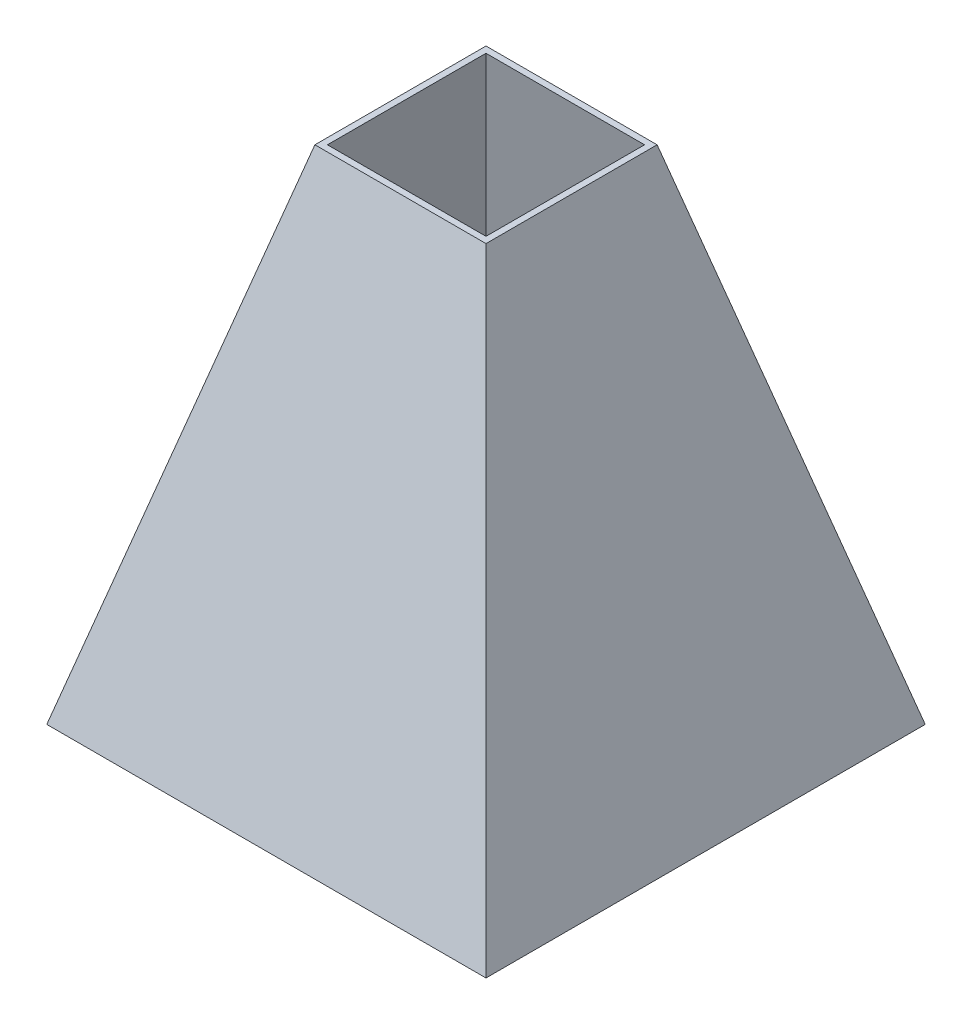
ISO-10303-21;
HEADER;
FILE_DESCRIPTION(('STEP AP214'),'2;1');
FILE_NAME('part.step','',(''),(''),'','','');
FILE_SCHEMA(('AUTOMOTIVE_DESIGN { 1 0 10303 214 1 1 1 1 }'));
ENDSEC;
DATA;
#1=APPLICATION_CONTEXT('core data for automotive mechanical design processes');
#2=APPLICATION_PROTOCOL_DEFINITION('international standard','automotive_design',2000,#1);
#3=PRODUCT_CONTEXT('',#1,'mechanical');
#4=PRODUCT('Part','Part','',(#3));
#5=PRODUCT_RELATED_PRODUCT_CATEGORY('part','',(#4));
#6=PRODUCT_DEFINITION_FORMATION('','',#4);
#7=PRODUCT_DEFINITION_CONTEXT('part definition',#1,'design');
#8=PRODUCT_DEFINITION('design','',#6,#7);
#9=PRODUCT_DEFINITION_SHAPE('','',#8);
#10=(LENGTH_UNIT() NAMED_UNIT(*) SI_UNIT(.MILLI.,.METRE.));
#11=(NAMED_UNIT(*) PLANE_ANGLE_UNIT() SI_UNIT($,.RADIAN.));
#12=(NAMED_UNIT(*) SI_UNIT($,.STERADIAN.) SOLID_ANGLE_UNIT());
#13=UNCERTAINTY_MEASURE_WITH_UNIT(LENGTH_MEASURE(1.E-05),#10,'distance_accuracy_value','');
#14=(GEOMETRIC_REPRESENTATION_CONTEXT(3) GLOBAL_UNCERTAINTY_ASSIGNED_CONTEXT((#13)) GLOBAL_UNIT_ASSIGNED_CONTEXT((#10,
#11,#12)) REPRESENTATION_CONTEXT('',''));
#15=CARTESIAN_POINT('',(0.,0.,0.));
#16=DIRECTION('',(0.,0.,1.));
#17=DIRECTION('',(1.,0.,0.));
#18=AXIS2_PLACEMENT_3D('',#15,#16,#17);
#19=CARTESIAN_POINT('',(0.,0.,0.));
#20=DIRECTION('',(0.,1.,0.));
#21=DIRECTION('',(0.,0.,1.));
#22=AXIS2_PLACEMENT_3D('',#19,#20,#21);
#23=PLANE('',#22);
#24=DIRECTION('',(0.,0.,-1.));
#25=VECTOR('',#24,1.);
#26=CARTESIAN_POINT('',(105.,0.,-105.));
#27=LINE('',#26,#25);
#28=CARTESIAN_POINT('',(105.,0.,105.));
#29=VERTEX_POINT('',#28);
#30=CARTESIAN_POINT('',(105.,0.,-105.));
#31=VERTEX_POINT('',#30);
#32=EDGE_CURVE('E191',#29,#31,#27,.T.);
#33=ORIENTED_EDGE('',*,*,#32,.F.);
#34=DIRECTION('',(1.,0.,0.));
#35=VECTOR('',#34,1.);
#36=CARTESIAN_POINT('',(-105.,0.,105.));
#37=LINE('',#36,#35);
#38=CARTESIAN_POINT('',(-105.,0.,105.));
#39=VERTEX_POINT('',#38);
#40=EDGE_CURVE('E192',#39,#29,#37,.T.);
#41=ORIENTED_EDGE('',*,*,#40,.F.);
#42=DIRECTION('',(0.,0.,1.));
#43=VECTOR('',#42,1.);
#44=CARTESIAN_POINT('',(-105.,0.,-105.));
#45=LINE('',#44,#43);
#46=CARTESIAN_POINT('',(-105.,0.,-105.));
#47=VERTEX_POINT('',#46);
#48=EDGE_CURVE('E61',#47,#39,#45,.T.);
#49=ORIENTED_EDGE('',*,*,#48,.F.);
#50=DIRECTION('',(-1.,0.,0.));
#51=VECTOR('',#50,1.);
#52=CARTESIAN_POINT('',(-105.,0.,-105.));
#53=LINE('',#52,#51);
#54=EDGE_CURVE('E12',#31,#47,#53,.T.);
#55=ORIENTED_EDGE('',*,*,#54,.F.);
#56=EDGE_LOOP('',(#33,#41,#49,#55));
#57=FACE_BOUND('',#56,.T.);
#58=DIRECTION('',(1.,0.,0.));
#59=VECTOR('',#58,1.);
#60=CARTESIAN_POINT('',(-102.,0.,-102.));
#61=LINE('',#60,#59);
#62=CARTESIAN_POINT('',(-102.,0.,-102.));
#63=VERTEX_POINT('',#62);
#64=CARTESIAN_POINT('',(102.,0.,-102.));
#65=VERTEX_POINT('',#64);
#66=EDGE_CURVE('E139',#63,#65,#61,.T.);
#67=ORIENTED_EDGE('',*,*,#66,.F.);
#68=DIRECTION('',(0.,0.,-1.));
#69=VECTOR('',#68,1.);
#70=CARTESIAN_POINT('',(-102.,0.,102.));
#71=LINE('',#70,#69);
#72=CARTESIAN_POINT('',(-102.,0.,102.));
#73=VERTEX_POINT('',#72);
#74=EDGE_CURVE('E124',#73,#63,#71,.T.);
#75=ORIENTED_EDGE('',*,*,#74,.F.);
#76=DIRECTION('',(-1.,0.,0.));
#77=VECTOR('',#76,1.);
#78=CARTESIAN_POINT('',(102.,0.,102.));
#79=LINE('',#78,#77);
#80=CARTESIAN_POINT('',(102.,0.,102.));
#81=VERTEX_POINT('',#80);
#82=EDGE_CURVE('E135',#81,#73,#79,.T.);
#83=ORIENTED_EDGE('',*,*,#82,.F.);
#84=DIRECTION('',(0.,0.,1.));
#85=VECTOR('',#84,1.);
#86=CARTESIAN_POINT('',(102.,0.,-102.));
#87=LINE('',#86,#85);
#88=EDGE_CURVE('E75',#65,#81,#87,.T.);
#89=ORIENTED_EDGE('',*,*,#88,.F.);
#90=EDGE_LOOP('',(#67,#75,#83,#89));
#91=FACE_BOUND('',#90,.T.);
#92=ADVANCED_FACE('F54',(#57,#91),#23,.F.);
#93=CARTESIAN_POINT('',(0.,240.,0.));
#94=DIRECTION('',(0.,1.,0.));
#95=DIRECTION('',(0.,0.,1.));
#96=AXIS2_PLACEMENT_3D('',#93,#94,#95);
#97=PLANE('',#96);
#98=DIRECTION('',(0.,0.,-1.));
#99=VECTOR('',#98,1.);
#100=CARTESIAN_POINT('',(40.905,240.,-40.905));
#101=LINE('',#100,#99);
#102=CARTESIAN_POINT('',(40.905,240.,40.905));
#103=VERTEX_POINT('',#102);
#104=CARTESIAN_POINT('',(40.905,240.,-40.905));
#105=VERTEX_POINT('',#104);
#106=EDGE_CURVE('E161',#103,#105,#101,.T.);
#107=ORIENTED_EDGE('',*,*,#106,.T.);
#108=DIRECTION('',(-1.,0.,0.));
#109=VECTOR('',#108,1.);
#110=CARTESIAN_POINT('',(-40.905,240.,-40.905));
#111=LINE('',#110,#109);
#112=CARTESIAN_POINT('',(-40.905,240.,-40.905));
#113=VERTEX_POINT('',#112);
#114=EDGE_CURVE('E224',#105,#113,#111,.T.);
#115=ORIENTED_EDGE('',*,*,#114,.T.);
#116=DIRECTION('',(0.,0.,1.));
#117=VECTOR('',#116,1.);
#118=CARTESIAN_POINT('',(-40.905,240.,-40.905));
#119=LINE('',#118,#117);
#120=CARTESIAN_POINT('',(-40.905,240.,40.905));
#121=VERTEX_POINT('',#120);
#122=EDGE_CURVE('E227',#113,#121,#119,.T.);
#123=ORIENTED_EDGE('',*,*,#122,.T.);
#124=DIRECTION('',(1.,0.,0.));
#125=VECTOR('',#124,1.);
#126=CARTESIAN_POINT('',(-40.905,240.,40.905));
#127=LINE('',#126,#125);
#128=EDGE_CURVE('E163',#121,#103,#127,.T.);
#129=ORIENTED_EDGE('',*,*,#128,.T.);
#130=EDGE_LOOP('',(#107,#115,#123,#129));
#131=FACE_BOUND('',#130,.T.);
#132=DIRECTION('',(0.,0.,1.));
#133=VECTOR('',#132,1.);
#134=CARTESIAN_POINT('',(-37.905,240.,-37.905));
#135=LINE('',#134,#133);
#136=CARTESIAN_POINT('',(-37.905,240.,-37.905));
#137=VERTEX_POINT('',#136);
#138=CARTESIAN_POINT('',(-37.905,240.,37.905));
#139=VERTEX_POINT('',#138);
#140=EDGE_CURVE('E127',#137,#139,#135,.T.);
#141=ORIENTED_EDGE('',*,*,#140,.F.);
#142=DIRECTION('',(-1.,0.,0.));
#143=VECTOR('',#142,1.);
#144=CARTESIAN_POINT('',(37.905,240.,-37.905));
#145=LINE('',#144,#143);
#146=CARTESIAN_POINT('',(37.905,240.,-37.905));
#147=VERTEX_POINT('',#146);
#148=EDGE_CURVE('E152',#147,#137,#145,.T.);
#149=ORIENTED_EDGE('',*,*,#148,.F.);
#150=DIRECTION('',(0.,0.,-1.));
#151=VECTOR('',#150,1.);
#152=CARTESIAN_POINT('',(37.905,240.,37.905));
#153=LINE('',#152,#151);
#154=CARTESIAN_POINT('',(37.905,240.,37.905));
#155=VERTEX_POINT('',#154);
#156=EDGE_CURVE('E160',#155,#147,#153,.T.);
#157=ORIENTED_EDGE('',*,*,#156,.F.);
#158=DIRECTION('',(1.,0.,0.));
#159=VECTOR('',#158,1.);
#160=CARTESIAN_POINT('',(-37.905,240.,37.905));
#161=LINE('',#160,#159);
#162=EDGE_CURVE('E159',#139,#155,#161,.T.);
#163=ORIENTED_EDGE('',*,*,#162,.F.);
#164=EDGE_LOOP('',(#141,#149,#157,#163));
#165=FACE_BOUND('',#164,.T.);
#166=ADVANCED_FACE('F157',(#131,#165),#97,.T.);
#167=CARTESIAN_POINT('',(98.0097140388294,26.1747192554949,0.));
#168=DIRECTION('',(0.966139662775963,0.258019673690106,0.));
#169=DIRECTION('',(-0.258019673690106,0.966139662775963,0.));
#170=AXIS2_PLACEMENT_3D('',#167,#168,#169);
#171=PLANE('',#170);
#172=DIRECTION('',(0.249837309539768,-0.935501276067468,0.249837309539768));
#173=VECTOR('',#172,1.);
#174=CARTESIAN_POINT('',(40.905,240.,40.905));
#175=LINE('',#174,#173);
#176=EDGE_CURVE('E211',#103,#29,#175,.T.);
#177=ORIENTED_EDGE('',*,*,#176,.T.);
#178=ORIENTED_EDGE('',*,*,#32,.T.);
#179=DIRECTION('',(0.249837309539768,-0.935501276067468,-0.249837309539768));
#180=VECTOR('',#179,1.);
#181=CARTESIAN_POINT('',(40.905,240.,-40.905));
#182=LINE('',#181,#180);
#183=EDGE_CURVE('E225',#105,#31,#182,.T.);
#184=ORIENTED_EDGE('',*,*,#183,.F.);
#185=ORIENTED_EDGE('',*,*,#106,.F.);
#186=EDGE_LOOP('',(#177,#178,#184,#185));
#187=FACE_BOUND('',#186,.T.);
#188=ADVANCED_FACE('F217',(#187),#171,.T.);
#189=CARTESIAN_POINT('',(0.,26.1747192554949,-98.0097140388294));
#190=DIRECTION('',(0.,0.258019673690106,-0.966139662775963));
#191=DIRECTION('',(0.,0.966139662775963,0.258019673690106));
#192=AXIS2_PLACEMENT_3D('',#189,#190,#191);
#193=PLANE('',#192);
#194=ORIENTED_EDGE('',*,*,#183,.T.);
#195=ORIENTED_EDGE('',*,*,#54,.T.);
#196=DIRECTION('',(-0.249837309539768,-0.935501276067468,-0.249837309539768));
#197=VECTOR('',#196,1.);
#198=CARTESIAN_POINT('',(-40.905,240.,-40.905));
#199=LINE('',#198,#197);
#200=EDGE_CURVE('E340',#113,#47,#199,.T.);
#201=ORIENTED_EDGE('',*,*,#200,.F.);
#202=ORIENTED_EDGE('',*,*,#114,.F.);
#203=EDGE_LOOP('',(#194,#195,#201,#202));
#204=FACE_BOUND('',#203,.T.);
#205=ADVANCED_FACE('F250',(#204),#193,.T.);
#206=CARTESIAN_POINT('',(0.,26.1747192554949,98.0097140388294));
#207=DIRECTION('',(0.,0.258019673690106,0.966139662775963));
#208=DIRECTION('',(0.,-0.966139662775963,0.258019673690106));
#209=AXIS2_PLACEMENT_3D('',#206,#207,#208);
#210=PLANE('',#209);
#211=DIRECTION('',(-0.249837309539768,-0.935501276067468,0.249837309539768));
#212=VECTOR('',#211,1.);
#213=CARTESIAN_POINT('',(-40.905,240.,40.905));
#214=LINE('',#213,#212);
#215=EDGE_CURVE('E213',#121,#39,#214,.T.);
#216=ORIENTED_EDGE('',*,*,#215,.T.);
#217=ORIENTED_EDGE('',*,*,#40,.T.);
#218=ORIENTED_EDGE('',*,*,#176,.F.);
#219=ORIENTED_EDGE('',*,*,#128,.F.);
#220=EDGE_LOOP('',(#216,#217,#218,#219));
#221=FACE_BOUND('',#220,.T.);
#222=ADVANCED_FACE('F207',(#221),#210,.T.);
#223=CARTESIAN_POINT('',(-98.0097140388294,26.1747192554949,0.));
#224=DIRECTION('',(-0.966139662775963,0.258019673690106,0.));
#225=DIRECTION('',(-0.258019673690106,-0.966139662775963,0.));
#226=AXIS2_PLACEMENT_3D('',#223,#224,#225);
#227=PLANE('',#226);
#228=ORIENTED_EDGE('',*,*,#200,.T.);
#229=ORIENTED_EDGE('',*,*,#48,.T.);
#230=ORIENTED_EDGE('',*,*,#215,.F.);
#231=ORIENTED_EDGE('',*,*,#122,.F.);
#232=EDGE_LOOP('',(#228,#229,#230,#231));
#233=FACE_BOUND('',#232,.T.);
#234=ADVANCED_FACE('F248',(#233),#227,.T.);
#235=CARTESIAN_POINT('',(0.,25.4268701339093,-95.2094364948629));
#236=DIRECTION('',(0.,-0.258019673690106,0.966139662775963));
#237=DIRECTION('',(0.,-0.966139662775963,-0.258019673690106));
#238=AXIS2_PLACEMENT_3D('',#235,#236,#237);
#239=PLANE('',#238);
#240=DIRECTION('',(0.249837309539768,0.935501276067468,0.249837309539768));
#241=VECTOR('',#240,1.);
#242=CARTESIAN_POINT('',(-102.,0.,-102.));
#243=LINE('',#242,#241);
#244=EDGE_CURVE('E138',#63,#137,#243,.T.);
#245=ORIENTED_EDGE('',*,*,#244,.F.);
#246=ORIENTED_EDGE('',*,*,#66,.T.);
#247=DIRECTION('',(-0.249837309539768,0.935501276067468,0.249837309539768));
#248=VECTOR('',#247,1.);
#249=CARTESIAN_POINT('',(102.,0.,-102.));
#250=LINE('',#249,#248);
#251=EDGE_CURVE('E129',#65,#147,#250,.T.);
#252=ORIENTED_EDGE('',*,*,#251,.T.);
#253=ORIENTED_EDGE('',*,*,#148,.T.);
#254=EDGE_LOOP('',(#245,#246,#252,#253));
#255=FACE_BOUND('',#254,.T.);
#256=ADVANCED_FACE('F147',(#255),#239,.T.);
#257=CARTESIAN_POINT('',(95.2094364948628,25.4268701339093,0.));
#258=DIRECTION('',(-0.966139662775963,-0.258019673690106,0.));
#259=DIRECTION('',(0.258019673690106,-0.966139662775963,0.));
#260=AXIS2_PLACEMENT_3D('',#257,#258,#259);
#261=PLANE('',#260);
#262=ORIENTED_EDGE('',*,*,#251,.F.);
#263=ORIENTED_EDGE('',*,*,#88,.T.);
#264=DIRECTION('',(-0.249837309539768,0.935501276067468,-0.249837309539768));
#265=VECTOR('',#264,1.);
#266=CARTESIAN_POINT('',(102.,0.,102.));
#267=LINE('',#266,#265);
#268=EDGE_CURVE('E126',#81,#155,#267,.T.);
#269=ORIENTED_EDGE('',*,*,#268,.T.);
#270=ORIENTED_EDGE('',*,*,#156,.T.);
#271=EDGE_LOOP('',(#262,#263,#269,#270));
#272=FACE_BOUND('',#271,.T.);
#273=ADVANCED_FACE('F401',(#272),#261,.T.);
#274=CARTESIAN_POINT('',(-95.2094364948629,25.4268701339093,0.));
#275=DIRECTION('',(0.966139662775963,-0.258019673690106,0.));
#276=DIRECTION('',(0.258019673690106,0.966139662775963,0.));
#277=AXIS2_PLACEMENT_3D('',#274,#275,#276);
#278=PLANE('',#277);
#279=DIRECTION('',(0.249837309539768,0.935501276067468,-0.249837309539768));
#280=VECTOR('',#279,1.);
#281=CARTESIAN_POINT('',(-102.,0.,102.));
#282=LINE('',#281,#280);
#283=EDGE_CURVE('E78',#73,#139,#282,.T.);
#284=ORIENTED_EDGE('',*,*,#283,.F.);
#285=ORIENTED_EDGE('',*,*,#74,.T.);
#286=ORIENTED_EDGE('',*,*,#244,.T.);
#287=ORIENTED_EDGE('',*,*,#140,.T.);
#288=EDGE_LOOP('',(#284,#285,#286,#287));
#289=FACE_BOUND('',#288,.T.);
#290=ADVANCED_FACE('F121',(#289),#278,.T.);
#291=CARTESIAN_POINT('',(0.,25.4268701339093,95.2094364948629));
#292=DIRECTION('',(0.,-0.258019673690106,-0.966139662775963));
#293=DIRECTION('',(0.,0.966139662775963,-0.258019673690106));
#294=AXIS2_PLACEMENT_3D('',#291,#292,#293);
#295=PLANE('',#294);
#296=ORIENTED_EDGE('',*,*,#268,.F.);
#297=ORIENTED_EDGE('',*,*,#82,.T.);
#298=ORIENTED_EDGE('',*,*,#283,.T.);
#299=ORIENTED_EDGE('',*,*,#162,.T.);
#300=EDGE_LOOP('',(#296,#297,#298,#299));
#301=FACE_BOUND('',#300,.T.);
#302=ADVANCED_FACE('F134',(#301),#295,.T.);
#303=CLOSED_SHELL('',(#92,#166,#188,#205,#222,#234,#256,#273,#290,#302));
#304=MANIFOLD_SOLID_BREP('B2',#303);
#305=ADVANCED_BREP_SHAPE_REPRESENTATION('',(#18,#304),#14);
#306=SHAPE_DEFINITION_REPRESENTATION(#9,#305);
ENDSEC;
END-ISO-10303-21;
